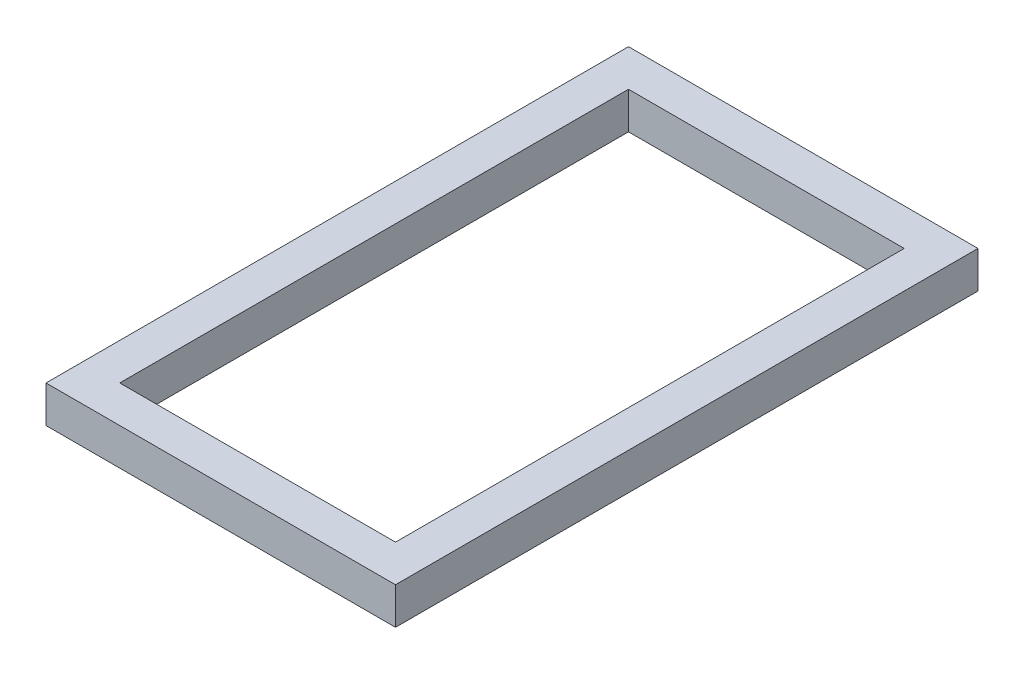
ISO-10303-21;
HEADER;
FILE_DESCRIPTION(('STEP AP214'),'2;1');
FILE_NAME('part.step','',(''),(''),'','','');
FILE_SCHEMA(('AUTOMOTIVE_DESIGN { 1 0 10303 214 1 1 1 1 }'));
ENDSEC;
DATA;
#1=APPLICATION_CONTEXT('core data for automotive mechanical design processes');
#2=APPLICATION_PROTOCOL_DEFINITION('international standard','automotive_design',2000,#1);
#3=PRODUCT_CONTEXT('',#1,'mechanical');
#4=PRODUCT('Part','Part','',(#3));
#5=PRODUCT_RELATED_PRODUCT_CATEGORY('part','',(#4));
#6=PRODUCT_DEFINITION_FORMATION('','',#4);
#7=PRODUCT_DEFINITION_CONTEXT('part definition',#1,'design');
#8=PRODUCT_DEFINITION('design','',#6,#7);
#9=PRODUCT_DEFINITION_SHAPE('','',#8);
#10=(LENGTH_UNIT() NAMED_UNIT(*) SI_UNIT(.MILLI.,.METRE.));
#11=(NAMED_UNIT(*) PLANE_ANGLE_UNIT() SI_UNIT($,.RADIAN.));
#12=(NAMED_UNIT(*) SI_UNIT($,.STERADIAN.) SOLID_ANGLE_UNIT());
#13=UNCERTAINTY_MEASURE_WITH_UNIT(LENGTH_MEASURE(1.E-05),#10,'distance_accuracy_value','');
#14=(GEOMETRIC_REPRESENTATION_CONTEXT(3) GLOBAL_UNCERTAINTY_ASSIGNED_CONTEXT((#13)) GLOBAL_UNIT_ASSIGNED_CONTEXT((#10,
#11,#12)) REPRESENTATION_CONTEXT('',''));
#15=CARTESIAN_POINT('',(0.,0.,0.));
#16=DIRECTION('',(0.,0.,1.));
#17=DIRECTION('',(1.,0.,0.));
#18=AXIS2_PLACEMENT_3D('',#15,#16,#17);
#19=CARTESIAN_POINT('',(0.,19.,0.));
#20=DIRECTION('',(0.,1.,0.));
#21=DIRECTION('',(0.,0.,1.));
#22=AXIS2_PLACEMENT_3D('',#19,#20,#21);
#23=PLANE('',#22);
#24=DIRECTION('',(0.,0.,-1.));
#25=VECTOR('',#24,1.);
#26=CARTESIAN_POINT('',(90.,19.,-150.));
#27=LINE('',#26,#25);
#28=CARTESIAN_POINT('',(90.,19.,150.));
#29=VERTEX_POINT('',#28);
#30=CARTESIAN_POINT('',(90.,19.,-150.));
#31=VERTEX_POINT('',#30);
#32=EDGE_CURVE('E134',#29,#31,#27,.T.);
#33=ORIENTED_EDGE('',*,*,#32,.T.);
#34=DIRECTION('',(-1.,0.,0.));
#35=VECTOR('',#34,1.);
#36=CARTESIAN_POINT('',(-90.0000000000001,19.,-150.));
#37=LINE('',#36,#35);
#38=CARTESIAN_POINT('',(-90.0000000000001,19.,-150.));
#39=VERTEX_POINT('',#38);
#40=EDGE_CURVE('E137',#31,#39,#37,.T.);
#41=ORIENTED_EDGE('',*,*,#40,.T.);
#42=DIRECTION('',(0.,0.,1.));
#43=VECTOR('',#42,1.);
#44=CARTESIAN_POINT('',(-90.0000000000001,19.,-150.));
#45=LINE('',#44,#43);
#46=CARTESIAN_POINT('',(-90.,19.,150.));
#47=VERTEX_POINT('',#46);
#48=EDGE_CURVE('E140',#39,#47,#45,.T.);
#49=ORIENTED_EDGE('',*,*,#48,.T.);
#50=DIRECTION('',(1.,0.,0.));
#51=VECTOR('',#50,1.);
#52=CARTESIAN_POINT('',(-90.,19.,150.));
#53=LINE('',#52,#51);
#54=EDGE_CURVE('E142',#47,#29,#53,.T.);
#55=ORIENTED_EDGE('',*,*,#54,.T.);
#56=EDGE_LOOP('',(#33,#41,#49,#55));
#57=FACE_BOUND('',#56,.T.);
#58=DIRECTION('',(1.,0.,0.));
#59=VECTOR('',#58,1.);
#60=CARTESIAN_POINT('',(-71.,19.,131.));
#61=LINE('',#60,#59);
#62=CARTESIAN_POINT('',(-71.,19.,131.));
#63=VERTEX_POINT('',#62);
#64=CARTESIAN_POINT('',(71.,19.,131.));
#65=VERTEX_POINT('',#64);
#66=EDGE_CURVE('E106',#63,#65,#61,.T.);
#67=ORIENTED_EDGE('',*,*,#66,.F.);
#68=DIRECTION('',(0.,0.,1.));
#69=VECTOR('',#68,1.);
#70=CARTESIAN_POINT('',(-71.0000000000001,19.,-131.));
#71=LINE('',#70,#69);
#72=CARTESIAN_POINT('',(-71.0000000000001,19.,-131.));
#73=VERTEX_POINT('',#72);
#74=EDGE_CURVE('E98',#73,#63,#71,.T.);
#75=ORIENTED_EDGE('',*,*,#74,.F.);
#76=DIRECTION('',(-1.,0.,0.));
#77=VECTOR('',#76,1.);
#78=CARTESIAN_POINT('',(-71.0000000000001,19.,-131.));
#79=LINE('',#78,#77);
#80=CARTESIAN_POINT('',(70.9999999999999,19.,-131.));
#81=VERTEX_POINT('',#80);
#82=EDGE_CURVE('E120',#81,#73,#79,.T.);
#83=ORIENTED_EDGE('',*,*,#82,.F.);
#84=DIRECTION('',(0.,0.,-1.));
#85=VECTOR('',#84,1.);
#86=CARTESIAN_POINT('',(70.9999999999999,19.,-131.));
#87=LINE('',#86,#85);
#88=EDGE_CURVE('E118',#65,#81,#87,.T.);
#89=ORIENTED_EDGE('',*,*,#88,.F.);
#90=EDGE_LOOP('',(#67,#75,#83,#89));
#91=FACE_BOUND('',#90,.T.);
#92=ADVANCED_FACE('F33',(#57,#91),#23,.T.);
#93=CARTESIAN_POINT('',(0.,0.,0.));
#94=DIRECTION('',(0.,1.,0.));
#95=DIRECTION('',(0.,0.,1.));
#96=AXIS2_PLACEMENT_3D('',#93,#94,#95);
#97=PLANE('',#96);
#98=DIRECTION('',(0.,0.,-1.));
#99=VECTOR('',#98,1.);
#100=CARTESIAN_POINT('',(90.,0.,-150.));
#101=LINE('',#100,#99);
#102=CARTESIAN_POINT('',(90.,0.,150.));
#103=VERTEX_POINT('',#102);
#104=CARTESIAN_POINT('',(90.,0.,-150.));
#105=VERTEX_POINT('',#104);
#106=EDGE_CURVE('E114',#103,#105,#101,.T.);
#107=ORIENTED_EDGE('',*,*,#106,.F.);
#108=DIRECTION('',(1.,0.,0.));
#109=VECTOR('',#108,1.);
#110=CARTESIAN_POINT('',(-90.,0.,150.));
#111=LINE('',#110,#109);
#112=CARTESIAN_POINT('',(-90.,0.,150.));
#113=VERTEX_POINT('',#112);
#114=EDGE_CURVE('E138',#113,#103,#111,.T.);
#115=ORIENTED_EDGE('',*,*,#114,.F.);
#116=DIRECTION('',(0.,0.,1.));
#117=VECTOR('',#116,1.);
#118=CARTESIAN_POINT('',(-90.0000000000001,0.,-150.));
#119=LINE('',#118,#117);
#120=CARTESIAN_POINT('',(-90.0000000000001,0.,-150.));
#121=VERTEX_POINT('',#120);
#122=EDGE_CURVE('E149',#121,#113,#119,.T.);
#123=ORIENTED_EDGE('',*,*,#122,.F.);
#124=DIRECTION('',(-1.,0.,0.));
#125=VECTOR('',#124,1.);
#126=CARTESIAN_POINT('',(-90.0000000000001,0.,-150.));
#127=LINE('',#126,#125);
#128=EDGE_CURVE('E147',#105,#121,#127,.T.);
#129=ORIENTED_EDGE('',*,*,#128,.F.);
#130=EDGE_LOOP('',(#107,#115,#123,#129));
#131=FACE_BOUND('',#130,.T.);
#132=DIRECTION('',(0.,0.,1.));
#133=VECTOR('',#132,1.);
#134=CARTESIAN_POINT('',(-71.0000000000001,0.,-131.));
#135=LINE('',#134,#133);
#136=CARTESIAN_POINT('',(-71.0000000000001,0.,-131.));
#137=VERTEX_POINT('',#136);
#138=CARTESIAN_POINT('',(-71.,0.,131.));
#139=VERTEX_POINT('',#138);
#140=EDGE_CURVE('E56',#137,#139,#135,.T.);
#141=ORIENTED_EDGE('',*,*,#140,.T.);
#142=DIRECTION('',(1.,0.,0.));
#143=VECTOR('',#142,1.);
#144=CARTESIAN_POINT('',(-71.,0.,131.));
#145=LINE('',#144,#143);
#146=CARTESIAN_POINT('',(71.,0.,131.));
#147=VERTEX_POINT('',#146);
#148=EDGE_CURVE('E113',#139,#147,#145,.T.);
#149=ORIENTED_EDGE('',*,*,#148,.T.);
#150=DIRECTION('',(0.,0.,-1.));
#151=VECTOR('',#150,1.);
#152=CARTESIAN_POINT('',(70.9999999999999,0.,-131.));
#153=LINE('',#152,#151);
#154=CARTESIAN_POINT('',(70.9999999999999,0.,-131.));
#155=VERTEX_POINT('',#154);
#156=EDGE_CURVE('E126',#147,#155,#153,.T.);
#157=ORIENTED_EDGE('',*,*,#156,.T.);
#158=DIRECTION('',(-1.,0.,0.));
#159=VECTOR('',#158,1.);
#160=CARTESIAN_POINT('',(-71.0000000000001,0.,-131.));
#161=LINE('',#160,#159);
#162=EDGE_CURVE('E107',#155,#137,#161,.T.);
#163=ORIENTED_EDGE('',*,*,#162,.T.);
#164=EDGE_LOOP('',(#141,#149,#157,#163));
#165=FACE_BOUND('',#164,.T.);
#166=ADVANCED_FACE('F167',(#131,#165),#97,.F.);
#167=CARTESIAN_POINT('',(90.,19.,-150.));
#168=DIRECTION('',(-1.,0.,0.));
#169=DIRECTION('',(0.,0.,1.));
#170=AXIS2_PLACEMENT_3D('',#167,#168,#169);
#171=PLANE('',#170);
#172=ORIENTED_EDGE('',*,*,#106,.T.);
#173=DIRECTION('',(0.,-1.,0.));
#174=VECTOR('',#173,1.);
#175=CARTESIAN_POINT('',(90.,19.,-150.));
#176=LINE('',#175,#174);
#177=EDGE_CURVE('E11',#31,#105,#176,.T.);
#178=ORIENTED_EDGE('',*,*,#177,.F.);
#179=ORIENTED_EDGE('',*,*,#32,.F.);
#180=DIRECTION('',(0.,-1.,0.));
#181=VECTOR('',#180,1.);
#182=CARTESIAN_POINT('',(90.,19.,150.));
#183=LINE('',#182,#181);
#184=EDGE_CURVE('E144',#29,#103,#183,.T.);
#185=ORIENTED_EDGE('',*,*,#184,.T.);
#186=EDGE_LOOP('',(#172,#178,#179,#185));
#187=FACE_BOUND('',#186,.T.);
#188=ADVANCED_FACE('F35',(#187),#171,.F.);
#189=CARTESIAN_POINT('',(-90.0000000000001,19.,-150.));
#190=DIRECTION('',(0.,0.,1.));
#191=DIRECTION('',(1.,0.,0.));
#192=AXIS2_PLACEMENT_3D('',#189,#190,#191);
#193=PLANE('',#192);
#194=ORIENTED_EDGE('',*,*,#128,.T.);
#195=DIRECTION('',(0.,-1.,0.));
#196=VECTOR('',#195,1.);
#197=CARTESIAN_POINT('',(-90.0000000000001,19.,-150.));
#198=LINE('',#197,#196);
#199=EDGE_CURVE('E41',#39,#121,#198,.T.);
#200=ORIENTED_EDGE('',*,*,#199,.F.);
#201=ORIENTED_EDGE('',*,*,#40,.F.);
#202=ORIENTED_EDGE('',*,*,#177,.T.);
#203=EDGE_LOOP('',(#194,#200,#201,#202));
#204=FACE_BOUND('',#203,.T.);
#205=ADVANCED_FACE('F177',(#204),#193,.F.);
#206=CARTESIAN_POINT('',(-90.0000000000001,19.,-150.));
#207=DIRECTION('',(1.,0.,0.));
#208=DIRECTION('',(0.,0.,-1.));
#209=AXIS2_PLACEMENT_3D('',#206,#207,#208);
#210=PLANE('',#209);
#211=ORIENTED_EDGE('',*,*,#122,.T.);
#212=DIRECTION('',(0.,-1.,0.));
#213=VECTOR('',#212,1.);
#214=CARTESIAN_POINT('',(-90.,19.,150.));
#215=LINE('',#214,#213);
#216=EDGE_CURVE('E154',#47,#113,#215,.T.);
#217=ORIENTED_EDGE('',*,*,#216,.F.);
#218=ORIENTED_EDGE('',*,*,#48,.F.);
#219=ORIENTED_EDGE('',*,*,#199,.T.);
#220=EDGE_LOOP('',(#211,#217,#218,#219));
#221=FACE_BOUND('',#220,.T.);
#222=ADVANCED_FACE('F161',(#221),#210,.F.);
#223=CARTESIAN_POINT('',(-90.,19.,150.));
#224=DIRECTION('',(0.,0.,-1.));
#225=DIRECTION('',(-1.,0.,0.));
#226=AXIS2_PLACEMENT_3D('',#223,#224,#225);
#227=PLANE('',#226);
#228=ORIENTED_EDGE('',*,*,#114,.T.);
#229=ORIENTED_EDGE('',*,*,#184,.F.);
#230=ORIENTED_EDGE('',*,*,#54,.F.);
#231=ORIENTED_EDGE('',*,*,#216,.T.);
#232=EDGE_LOOP('',(#228,#229,#230,#231));
#233=FACE_BOUND('',#232,.T.);
#234=ADVANCED_FACE('F171',(#233),#227,.F.);
#235=CARTESIAN_POINT('',(-71.0000000000001,19.,-131.));
#236=DIRECTION('',(1.,0.,0.));
#237=DIRECTION('',(0.,0.,-1.));
#238=AXIS2_PLACEMENT_3D('',#235,#236,#237);
#239=PLANE('',#238);
#240=ORIENTED_EDGE('',*,*,#140,.F.);
#241=DIRECTION('',(0.,-1.,0.));
#242=VECTOR('',#241,1.);
#243=CARTESIAN_POINT('',(-71.0000000000001,19.,-131.));
#244=LINE('',#243,#242);
#245=EDGE_CURVE('E102',#73,#137,#244,.T.);
#246=ORIENTED_EDGE('',*,*,#245,.F.);
#247=ORIENTED_EDGE('',*,*,#74,.T.);
#248=DIRECTION('',(0.,-1.,0.));
#249=VECTOR('',#248,1.);
#250=CARTESIAN_POINT('',(-71.,19.,131.));
#251=LINE('',#250,#249);
#252=EDGE_CURVE('E101',#63,#139,#251,.T.);
#253=ORIENTED_EDGE('',*,*,#252,.T.);
#254=EDGE_LOOP('',(#240,#246,#247,#253));
#255=FACE_BOUND('',#254,.T.);
#256=ADVANCED_FACE('F100',(#255),#239,.T.);
#257=CARTESIAN_POINT('',(-71.,19.,131.));
#258=DIRECTION('',(0.,0.,-1.));
#259=DIRECTION('',(-1.,0.,0.));
#260=AXIS2_PLACEMENT_3D('',#257,#258,#259);
#261=PLANE('',#260);
#262=ORIENTED_EDGE('',*,*,#148,.F.);
#263=ORIENTED_EDGE('',*,*,#252,.F.);
#264=ORIENTED_EDGE('',*,*,#66,.T.);
#265=DIRECTION('',(0.,-1.,0.));
#266=VECTOR('',#265,1.);
#267=CARTESIAN_POINT('',(71.,19.,131.));
#268=LINE('',#267,#266);
#269=EDGE_CURVE('E115',#65,#147,#268,.T.);
#270=ORIENTED_EDGE('',*,*,#269,.T.);
#271=EDGE_LOOP('',(#262,#263,#264,#270));
#272=FACE_BOUND('',#271,.T.);
#273=ADVANCED_FACE('F110',(#272),#261,.T.);
#274=CARTESIAN_POINT('',(70.9999999999999,19.,-131.));
#275=DIRECTION('',(-1.,0.,0.));
#276=DIRECTION('',(0.,0.,1.));
#277=AXIS2_PLACEMENT_3D('',#274,#275,#276);
#278=PLANE('',#277);
#279=ORIENTED_EDGE('',*,*,#156,.F.);
#280=ORIENTED_EDGE('',*,*,#269,.F.);
#281=ORIENTED_EDGE('',*,*,#88,.T.);
#282=DIRECTION('',(0.,-1.,0.));
#283=VECTOR('',#282,1.);
#284=CARTESIAN_POINT('',(70.9999999999999,19.,-131.));
#285=LINE('',#284,#283);
#286=EDGE_CURVE('E48',#81,#155,#285,.T.);
#287=ORIENTED_EDGE('',*,*,#286,.T.);
#288=EDGE_LOOP('',(#279,#280,#281,#287));
#289=FACE_BOUND('',#288,.T.);
#290=ADVANCED_FACE('F200',(#289),#278,.T.);
#291=CARTESIAN_POINT('',(-71.0000000000001,19.,-131.));
#292=DIRECTION('',(0.,0.,1.));
#293=DIRECTION('',(1.,0.,0.));
#294=AXIS2_PLACEMENT_3D('',#291,#292,#293);
#295=PLANE('',#294);
#296=ORIENTED_EDGE('',*,*,#162,.F.);
#297=ORIENTED_EDGE('',*,*,#286,.F.);
#298=ORIENTED_EDGE('',*,*,#82,.T.);
#299=ORIENTED_EDGE('',*,*,#245,.T.);
#300=EDGE_LOOP('',(#296,#297,#298,#299));
#301=FACE_BOUND('',#300,.T.);
#302=ADVANCED_FACE('F204',(#301),#295,.T.);
#303=CLOSED_SHELL('',(#92,#166,#188,#205,#222,#234,#256,#273,#290,#302));
#304=MANIFOLD_SOLID_BREP('B2',#303);
#305=ADVANCED_BREP_SHAPE_REPRESENTATION('',(#18,#304),#14);
#306=SHAPE_DEFINITION_REPRESENTATION(#9,#305);
ENDSEC;
END-ISO-10303-21;
